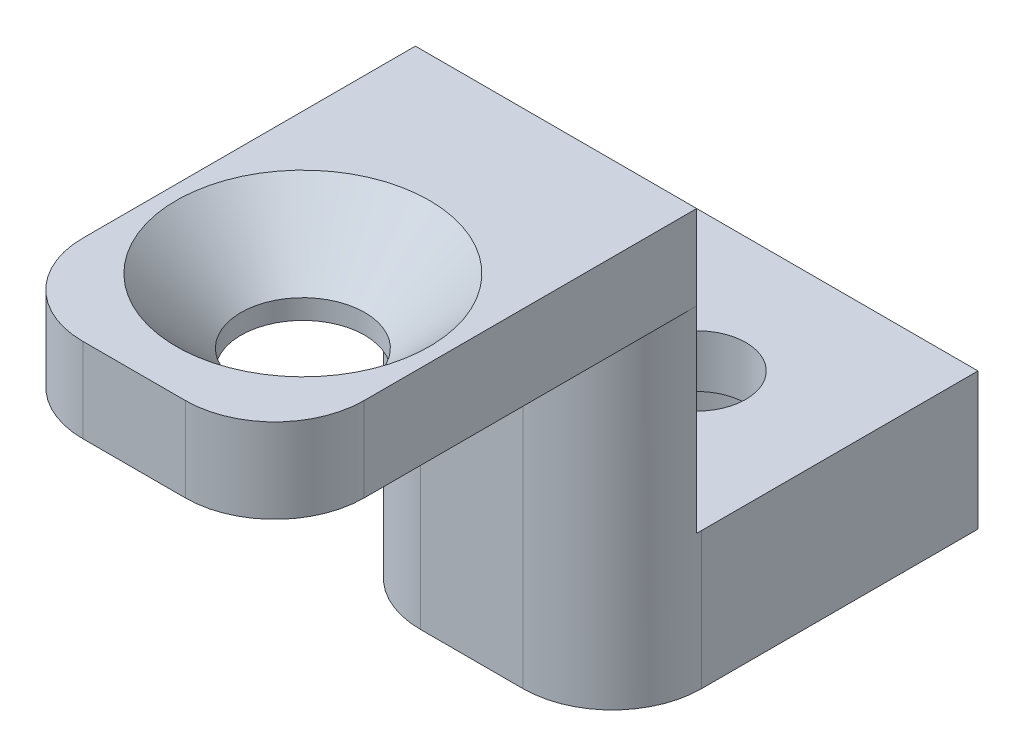
ISO-10303-21;
HEADER;
FILE_DESCRIPTION(('STEP AP214'),'2;1');
FILE_NAME('part.step','',(''),(''),'','','');
FILE_SCHEMA(('AUTOMOTIVE_DESIGN { 1 0 10303 214 1 1 1 1 }'));
ENDSEC;
DATA;
#1=APPLICATION_CONTEXT('core data for automotive mechanical design processes');
#2=APPLICATION_PROTOCOL_DEFINITION('international standard','automotive_design',2000,#1);
#3=PRODUCT_CONTEXT('',#1,'mechanical');
#4=PRODUCT('Part','Part','',(#3));
#5=PRODUCT_RELATED_PRODUCT_CATEGORY('part','',(#4));
#6=PRODUCT_DEFINITION_FORMATION('','',#4);
#7=PRODUCT_DEFINITION_CONTEXT('part definition',#1,'design');
#8=PRODUCT_DEFINITION('design','',#6,#7);
#9=PRODUCT_DEFINITION_SHAPE('','',#8);
#10=(LENGTH_UNIT() NAMED_UNIT(*) SI_UNIT(.MILLI.,.METRE.));
#11=(NAMED_UNIT(*) PLANE_ANGLE_UNIT() SI_UNIT($,.RADIAN.));
#12=(NAMED_UNIT(*) SI_UNIT($,.STERADIAN.) SOLID_ANGLE_UNIT());
#13=UNCERTAINTY_MEASURE_WITH_UNIT(LENGTH_MEASURE(1.E-05),#10,'distance_accuracy_value','');
#14=(GEOMETRIC_REPRESENTATION_CONTEXT(3) GLOBAL_UNCERTAINTY_ASSIGNED_CONTEXT((#13)) GLOBAL_UNIT_ASSIGNED_CONTEXT((#10,
#11,#12)) REPRESENTATION_CONTEXT('',''));
#15=CARTESIAN_POINT('',(0.,0.,0.));
#16=DIRECTION('',(0.,0.,1.));
#17=DIRECTION('',(1.,0.,0.));
#18=AXIS2_PLACEMENT_3D('',#15,#16,#17);
#19=CARTESIAN_POINT('',(5.,0.,0.));
#20=DIRECTION('',(1.,0.,0.));
#21=DIRECTION('',(0.,0.,-1.));
#22=AXIS2_PLACEMENT_3D('',#19,#20,#21);
#23=PLANE('',#22);
#24=DIRECTION('',(0.,0.,1.));
#25=VECTOR('',#24,1.);
#26=CARTESIAN_POINT('',(5.,-7.,-13.));
#27=LINE('',#26,#25);
#28=CARTESIAN_POINT('',(5.,-7.,-13.));
#29=VERTEX_POINT('',#28);
#30=CARTESIAN_POINT('',(5.,-7.,-3.175));
#31=VERTEX_POINT('',#30);
#32=EDGE_CURVE('E161',#29,#31,#27,.T.);
#33=ORIENTED_EDGE('',*,*,#32,.T.);
#34=DIRECTION('',(0.,-1.,0.));
#35=VECTOR('',#34,1.);
#36=CARTESIAN_POINT('',(5.,-11.87,-3.175));
#37=LINE('',#36,#35);
#38=CARTESIAN_POINT('',(5.,-11.87,-3.175));
#39=VERTEX_POINT('',#38);
#40=EDGE_CURVE('E143',#31,#39,#37,.T.);
#41=ORIENTED_EDGE('',*,*,#40,.T.);
#42=DIRECTION('',(0.,0.,-1.));
#43=VECTOR('',#42,1.);
#44=CARTESIAN_POINT('',(5.,-11.87,0.));
#45=LINE('',#44,#43);
#46=CARTESIAN_POINT('',(5.,-11.87,-13.));
#47=VERTEX_POINT('',#46);
#48=EDGE_CURVE('E136',#39,#47,#45,.T.);
#49=ORIENTED_EDGE('',*,*,#48,.T.);
#50=DIRECTION('',(0.,1.,0.));
#51=VECTOR('',#50,1.);
#52=CARTESIAN_POINT('',(5.,-11.87,-13.));
#53=LINE('',#52,#51);
#54=EDGE_CURVE('E140',#47,#29,#53,.T.);
#55=ORIENTED_EDGE('',*,*,#54,.T.);
#56=EDGE_LOOP('',(#33,#41,#49,#55));
#57=FACE_BOUND('',#56,.T.);
#58=ADVANCED_FACE('F34',(#57),#23,.T.);
#59=CARTESIAN_POINT('',(-5.,0.,0.));
#60=DIRECTION('',(1.,0.,0.));
#61=DIRECTION('',(0.,0.,-1.));
#62=AXIS2_PLACEMENT_3D('',#59,#60,#61);
#63=PLANE('',#62);
#64=DIRECTION('',(0.,0.,-1.));
#65=VECTOR('',#64,1.);
#66=CARTESIAN_POINT('',(-5.,-11.87,0.));
#67=LINE('',#66,#65);
#68=CARTESIAN_POINT('',(-5.,-11.87,-3.175));
#69=VERTEX_POINT('',#68);
#70=CARTESIAN_POINT('',(-5.,-11.87,-13.));
#71=VERTEX_POINT('',#70);
#72=EDGE_CURVE('E152',#69,#71,#67,.T.);
#73=ORIENTED_EDGE('',*,*,#72,.F.);
#74=DIRECTION('',(0.,-1.,0.));
#75=VECTOR('',#74,1.);
#76=CARTESIAN_POINT('',(-5.,0.,-3.175));
#77=LINE('',#76,#75);
#78=CARTESIAN_POINT('',(-5.,-7.,-3.175));
#79=VERTEX_POINT('',#78);
#80=EDGE_CURVE('E211',#69,#79,#77,.F.);
#81=ORIENTED_EDGE('',*,*,#80,.T.);
#82=DIRECTION('',(0.,0.,1.));
#83=VECTOR('',#82,1.);
#84=CARTESIAN_POINT('',(-5.,-7.,-13.));
#85=LINE('',#84,#83);
#86=CARTESIAN_POINT('',(-5.,-7.,-13.));
#87=VERTEX_POINT('',#86);
#88=EDGE_CURVE('E178',#87,#79,#85,.T.);
#89=ORIENTED_EDGE('',*,*,#88,.F.);
#90=DIRECTION('',(0.,1.,0.));
#91=VECTOR('',#90,1.);
#92=CARTESIAN_POINT('',(-5.,-11.87,-13.));
#93=LINE('',#92,#91);
#94=EDGE_CURVE('E176',#71,#87,#93,.T.);
#95=ORIENTED_EDGE('',*,*,#94,.F.);
#96=EDGE_LOOP('',(#73,#81,#89,#95));
#97=FACE_BOUND('',#96,.T.);
#98=ADVANCED_FACE('F259',(#97),#63,.F.);
#99=CARTESIAN_POINT('',(5.,3.,12.));
#100=DIRECTION('',(0.,0.,-1.));
#101=DIRECTION('',(-1.,0.,0.));
#102=AXIS2_PLACEMENT_3D('',#99,#100,#101);
#103=PLANE('',#102);
#104=DIRECTION('',(-1.,0.,0.));
#105=VECTOR('',#104,1.);
#106=CARTESIAN_POINT('',(5.,3.,12.));
#107=LINE('',#106,#105);
#108=CARTESIAN_POINT('',(1.825,3.,12.));
#109=VERTEX_POINT('',#108);
#110=CARTESIAN_POINT('',(-1.825,3.,12.));
#111=VERTEX_POINT('',#110);
#112=EDGE_CURVE('E171',#109,#111,#107,.T.);
#113=ORIENTED_EDGE('',*,*,#112,.T.);
#114=DIRECTION('',(0.,-1.,0.));
#115=VECTOR('',#114,1.);
#116=CARTESIAN_POINT('',(-1.825,3.,12.));
#117=LINE('',#116,#115);
#118=CARTESIAN_POINT('',(-1.825,0.,12.));
#119=VERTEX_POINT('',#118);
#120=EDGE_CURVE('E234',#111,#119,#117,.T.);
#121=ORIENTED_EDGE('',*,*,#120,.T.);
#122=DIRECTION('',(-1.,0.,0.));
#123=VECTOR('',#122,1.);
#124=CARTESIAN_POINT('',(5.,0.,12.));
#125=LINE('',#124,#123);
#126=CARTESIAN_POINT('',(1.825,0.,12.));
#127=VERTEX_POINT('',#126);
#128=EDGE_CURVE('E197',#127,#119,#125,.T.);
#129=ORIENTED_EDGE('',*,*,#128,.F.);
#130=DIRECTION('',(0.,-1.,0.));
#131=VECTOR('',#130,1.);
#132=CARTESIAN_POINT('',(1.825,3.,12.));
#133=LINE('',#132,#131);
#134=EDGE_CURVE('E232',#127,#109,#133,.F.);
#135=ORIENTED_EDGE('',*,*,#134,.T.);
#136=EDGE_LOOP('',(#113,#121,#129,#135));
#137=FACE_BOUND('',#136,.T.);
#138=ADVANCED_FACE('F279',(#137),#103,.F.);
#139=CARTESIAN_POINT('',(5.,0.,12.));
#140=DIRECTION('',(0.,1.,0.));
#141=DIRECTION('',(0.,0.,1.));
#142=AXIS2_PLACEMENT_3D('',#139,#140,#141);
#143=PLANE('',#142);
#144=CARTESIAN_POINT('',(0.,0.,6.));
#145=DIRECTION('',(0.,-1.,0.));
#146=DIRECTION('',(0.,0.,-1.));
#147=AXIS2_PLACEMENT_3D('',#144,#145,#146);
#148=CIRCLE('',#147,2.2);
#149=CARTESIAN_POINT('',(0.,0.,3.8));
#150=VERTEX_POINT('',#149);
#151=EDGE_CURVE('E325',#150,#150,#148,.T.);
#152=ORIENTED_EDGE('',*,*,#151,.F.);
#153=EDGE_LOOP('',(#152));
#154=FACE_BOUND('',#153,.T.);
#155=ORIENTED_EDGE('',*,*,#128,.T.);
#156=CARTESIAN_POINT('',(-1.825,0.,8.825));
#157=DIRECTION('',(0.,1.,0.));
#158=DIRECTION('',(0.,0.,1.));
#159=AXIS2_PLACEMENT_3D('',#156,#157,#158);
#160=CIRCLE('',#159,3.175);
#161=CARTESIAN_POINT('',(-5.,0.,8.825));
#162=VERTEX_POINT('',#161);
#163=EDGE_CURVE('E239',#119,#162,#160,.F.);
#164=ORIENTED_EDGE('',*,*,#163,.T.);
#165=DIRECTION('',(0.,0.,-1.));
#166=VECTOR('',#165,1.);
#167=CARTESIAN_POINT('',(-5.,0.,12.));
#168=LINE('',#167,#166);
#169=CARTESIAN_POINT('',(-5.,0.,-3.));
#170=VERTEX_POINT('',#169);
#171=EDGE_CURVE('E172',#162,#170,#168,.T.);
#172=ORIENTED_EDGE('',*,*,#171,.T.);
#173=DIRECTION('',(-1.,0.,0.));
#174=VECTOR('',#173,1.);
#175=CARTESIAN_POINT('',(5.,0.,-3.));
#176=LINE('',#175,#174);
#177=CARTESIAN_POINT('',(-4.99517349682947,0.,-3.));
#178=VERTEX_POINT('',#177);
#179=EDGE_CURVE('E223',#178,#170,#176,.T.);
#180=ORIENTED_EDGE('',*,*,#179,.F.);
#181=CARTESIAN_POINT('',(-1.825,0.,-3.175));
#182=DIRECTION('',(0.,1.,0.));
#183=DIRECTION('',(0.,0.,1.));
#184=AXIS2_PLACEMENT_3D('',#181,#182,#183);
#185=CIRCLE('',#184,3.175);
#186=CARTESIAN_POINT('',(-1.825,0.,0.));
#187=VERTEX_POINT('',#186);
#188=EDGE_CURVE('E42',#178,#187,#185,.T.);
#189=ORIENTED_EDGE('',*,*,#188,.T.);
#190=DIRECTION('',(-1.,0.,0.));
#191=VECTOR('',#190,1.);
#192=CARTESIAN_POINT('',(5.,0.,0.));
#193=LINE('',#192,#191);
#194=CARTESIAN_POINT('',(1.825,0.,0.));
#195=VERTEX_POINT('',#194);
#196=EDGE_CURVE('E194',#195,#187,#193,.T.);
#197=ORIENTED_EDGE('',*,*,#196,.F.);
#198=CARTESIAN_POINT('',(1.825,0.,-3.175));
#199=DIRECTION('',(0.,1.,0.));
#200=DIRECTION('',(0.,0.,1.));
#201=AXIS2_PLACEMENT_3D('',#198,#199,#200);
#202=CIRCLE('',#201,3.175);
#203=CARTESIAN_POINT('',(4.99517349682947,0.,-3.));
#204=VERTEX_POINT('',#203);
#205=EDGE_CURVE('E11',#195,#204,#202,.T.);
#206=ORIENTED_EDGE('',*,*,#205,.T.);
#207=DIRECTION('',(-1.,0.,0.));
#208=VECTOR('',#207,1.);
#209=CARTESIAN_POINT('',(5.,0.,-3.));
#210=LINE('',#209,#208);
#211=CARTESIAN_POINT('',(5.,0.,-3.));
#212=VERTEX_POINT('',#211);
#213=EDGE_CURVE('E217',#212,#204,#210,.T.);
#214=ORIENTED_EDGE('',*,*,#213,.F.);
#215=DIRECTION('',(0.,0.,-1.));
#216=VECTOR('',#215,1.);
#217=CARTESIAN_POINT('',(5.,0.,12.));
#218=LINE('',#217,#216);
#219=CARTESIAN_POINT('',(5.,0.,8.825));
#220=VERTEX_POINT('',#219);
#221=EDGE_CURVE('E49',#220,#212,#218,.T.);
#222=ORIENTED_EDGE('',*,*,#221,.F.);
#223=CARTESIAN_POINT('',(1.825,0.,8.825));
#224=DIRECTION('',(0.,1.,0.));
#225=DIRECTION('',(0.,0.,1.));
#226=AXIS2_PLACEMENT_3D('',#223,#224,#225);
#227=CIRCLE('',#226,3.175);
#228=EDGE_CURVE('E237',#220,#127,#227,.F.);
#229=ORIENTED_EDGE('',*,*,#228,.T.);
#230=EDGE_LOOP('',(#155,#164,#172,#180,#189,#197,#206,#214,#222,#229));
#231=FACE_BOUND('',#230,.T.);
#232=ADVANCED_FACE('F246',(#154,#231),#143,.F.);
#233=CARTESIAN_POINT('',(5.,0.,0.));
#234=DIRECTION('',(0.,0.,-1.));
#235=DIRECTION('',(0.,1.,0.));
#236=AXIS2_PLACEMENT_3D('',#233,#234,#235);
#237=PLANE('',#236);
#238=ORIENTED_EDGE('',*,*,#196,.T.);
#239=DIRECTION('',(0.,-1.,0.));
#240=VECTOR('',#239,1.);
#241=CARTESIAN_POINT('',(-1.825,0.,0.));
#242=LINE('',#241,#240);
#243=CARTESIAN_POINT('',(-1.825,-11.87,0.));
#244=VERTEX_POINT('',#243);
#245=EDGE_CURVE('E202',#187,#244,#242,.T.);
#246=ORIENTED_EDGE('',*,*,#245,.T.);
#247=DIRECTION('',(-1.,0.,0.));
#248=VECTOR('',#247,1.);
#249=CARTESIAN_POINT('',(5.,-11.87,0.));
#250=LINE('',#249,#248);
#251=CARTESIAN_POINT('',(1.825,-11.87,0.));
#252=VERTEX_POINT('',#251);
#253=EDGE_CURVE('E155',#252,#244,#250,.T.);
#254=ORIENTED_EDGE('',*,*,#253,.F.);
#255=DIRECTION('',(0.,-1.,0.));
#256=VECTOR('',#255,1.);
#257=CARTESIAN_POINT('',(1.825,0.,0.));
#258=LINE('',#257,#256);
#259=EDGE_CURVE('E200',#252,#195,#258,.F.);
#260=ORIENTED_EDGE('',*,*,#259,.T.);
#261=EDGE_LOOP('',(#238,#246,#254,#260));
#262=FACE_BOUND('',#261,.T.);
#263=ADVANCED_FACE('F252',(#262),#237,.F.);
#264=CARTESIAN_POINT('',(5.,-11.87,0.));
#265=DIRECTION('',(0.,1.,0.));
#266=DIRECTION('',(0.,0.,1.));
#267=AXIS2_PLACEMENT_3D('',#264,#265,#266);
#268=PLANE('',#267);
#269=CARTESIAN_POINT('',(0.,-11.87,-8.));
#270=DIRECTION('',(0.,-1.,0.));
#271=DIRECTION('',(0.,0.,-1.));
#272=AXIS2_PLACEMENT_3D('',#269,#270,#271);
#273=CIRCLE('',#272,3.2);
#274=CARTESIAN_POINT('',(0.,-11.87,-11.2));
#275=VERTEX_POINT('',#274);
#276=EDGE_CURVE('E339',#275,#275,#273,.T.);
#277=ORIENTED_EDGE('',*,*,#276,.F.);
#278=EDGE_LOOP('',(#277));
#279=FACE_BOUND('',#278,.T.);
#280=ORIENTED_EDGE('',*,*,#253,.T.);
#281=CARTESIAN_POINT('',(-1.825,-11.87,-3.175));
#282=DIRECTION('',(0.,1.,0.));
#283=DIRECTION('',(0.,0.,1.));
#284=AXIS2_PLACEMENT_3D('',#281,#282,#283);
#285=CIRCLE('',#284,3.175);
#286=EDGE_CURVE('E207',#244,#69,#285,.F.);
#287=ORIENTED_EDGE('',*,*,#286,.T.);
#288=ORIENTED_EDGE('',*,*,#72,.T.);
#289=DIRECTION('',(-1.,0.,0.));
#290=VECTOR('',#289,1.);
#291=CARTESIAN_POINT('',(5.,-11.87,-13.));
#292=LINE('',#291,#290);
#293=EDGE_CURVE('E148',#47,#71,#292,.T.);
#294=ORIENTED_EDGE('',*,*,#293,.F.);
#295=ORIENTED_EDGE('',*,*,#48,.F.);
#296=CARTESIAN_POINT('',(1.825,-11.87,-3.175));
#297=DIRECTION('',(0.,1.,0.));
#298=DIRECTION('',(0.,0.,1.));
#299=AXIS2_PLACEMENT_3D('',#296,#297,#298);
#300=CIRCLE('',#299,3.175);
#301=EDGE_CURVE('E205',#39,#252,#300,.F.);
#302=ORIENTED_EDGE('',*,*,#301,.T.);
#303=EDGE_LOOP('',(#280,#287,#288,#294,#295,#302));
#304=FACE_BOUND('',#303,.T.);
#305=ADVANCED_FACE('F150',(#279,#304),#268,.F.);
#306=CARTESIAN_POINT('',(5.,-11.87,-13.));
#307=DIRECTION('',(0.,0.,1.));
#308=DIRECTION('',(1.,0.,0.));
#309=AXIS2_PLACEMENT_3D('',#306,#307,#308);
#310=PLANE('',#309);
#311=ORIENTED_EDGE('',*,*,#94,.T.);
#312=DIRECTION('',(-1.,0.,0.));
#313=VECTOR('',#312,1.);
#314=CARTESIAN_POINT('',(5.,-7.,-13.));
#315=LINE('',#314,#313);
#316=EDGE_CURVE('E156',#29,#87,#315,.T.);
#317=ORIENTED_EDGE('',*,*,#316,.F.);
#318=ORIENTED_EDGE('',*,*,#54,.F.);
#319=ORIENTED_EDGE('',*,*,#293,.T.);
#320=EDGE_LOOP('',(#311,#317,#318,#319));
#321=FACE_BOUND('',#320,.T.);
#322=ADVANCED_FACE('F158',(#321),#310,.F.);
#323=CARTESIAN_POINT('',(5.,-7.,-13.));
#324=DIRECTION('',(0.,-1.,0.));
#325=DIRECTION('',(0.,0.,-1.));
#326=AXIS2_PLACEMENT_3D('',#323,#324,#325);
#327=PLANE('',#326);
#328=CARTESIAN_POINT('',(0.,-7.,-8.));
#329=DIRECTION('',(0.,-1.,0.));
#330=DIRECTION('',(0.,0.,-1.));
#331=AXIS2_PLACEMENT_3D('',#328,#329,#330);
#332=CIRCLE('',#331,1.75);
#333=CARTESIAN_POINT('',(0.,-7.,-9.75));
#334=VERTEX_POINT('',#333);
#335=EDGE_CURVE('E330',#334,#334,#332,.T.);
#336=ORIENTED_EDGE('',*,*,#335,.T.);
#337=EDGE_LOOP('',(#336));
#338=FACE_BOUND('',#337,.T.);
#339=ORIENTED_EDGE('',*,*,#88,.T.);
#340=CARTESIAN_POINT('',(-1.825,-7.,-3.175));
#341=DIRECTION('',(0.,-1.,0.));
#342=DIRECTION('',(0.,0.,-1.));
#343=AXIS2_PLACEMENT_3D('',#340,#341,#342);
#344=CIRCLE('',#343,3.175);
#345=CARTESIAN_POINT('',(-4.99517349682947,-7.,-3.));
#346=VERTEX_POINT('',#345);
#347=EDGE_CURVE('E215',#79,#346,#344,.F.);
#348=ORIENTED_EDGE('',*,*,#347,.T.);
#349=DIRECTION('',(-1.,0.,0.));
#350=VECTOR('',#349,1.);
#351=CARTESIAN_POINT('',(5.,-7.,-3.));
#352=LINE('',#351,#350);
#353=CARTESIAN_POINT('',(4.99517349682947,-7.,-3.));
#354=VERTEX_POINT('',#353);
#355=EDGE_CURVE('E189',#354,#346,#352,.T.);
#356=ORIENTED_EDGE('',*,*,#355,.F.);
#357=CARTESIAN_POINT('',(1.825,-7.,-3.175));
#358=DIRECTION('',(0.,-1.,0.));
#359=DIRECTION('',(0.,0.,-1.));
#360=AXIS2_PLACEMENT_3D('',#357,#358,#359);
#361=CIRCLE('',#360,3.175);
#362=EDGE_CURVE('E213',#354,#31,#361,.F.);
#363=ORIENTED_EDGE('',*,*,#362,.T.);
#364=ORIENTED_EDGE('',*,*,#32,.F.);
#365=ORIENTED_EDGE('',*,*,#316,.T.);
#366=EDGE_LOOP('',(#339,#348,#356,#363,#364,#365));
#367=FACE_BOUND('',#366,.T.);
#368=ADVANCED_FACE('F262',(#338,#367),#327,.F.);
#369=CARTESIAN_POINT('',(5.,-7.,-3.));
#370=DIRECTION('',(0.,0.,1.));
#371=DIRECTION('',(0.,-1.,0.));
#372=AXIS2_PLACEMENT_3D('',#369,#370,#371);
#373=PLANE('',#372);
#374=ORIENTED_EDGE('',*,*,#355,.T.);
#375=DIRECTION('',(0.,-1.,0.));
#376=VECTOR('',#375,1.);
#377=CARTESIAN_POINT('',(-4.99517349682947,0.,-3.));
#378=LINE('',#377,#376);
#379=EDGE_CURVE('E226',#346,#178,#378,.F.);
#380=ORIENTED_EDGE('',*,*,#379,.T.);
#381=ORIENTED_EDGE('',*,*,#179,.T.);
#382=DIRECTION('',(0.,1.,0.));
#383=VECTOR('',#382,1.);
#384=CARTESIAN_POINT('',(-5.,-7.,-3.));
#385=LINE('',#384,#383);
#386=CARTESIAN_POINT('',(-5.,3.,-3.));
#387=VERTEX_POINT('',#386);
#388=EDGE_CURVE('E181',#170,#387,#385,.T.);
#389=ORIENTED_EDGE('',*,*,#388,.T.);
#390=DIRECTION('',(-1.,0.,0.));
#391=VECTOR('',#390,1.);
#392=CARTESIAN_POINT('',(5.,3.,-3.));
#393=LINE('',#392,#391);
#394=CARTESIAN_POINT('',(5.,3.,-3.));
#395=VERTEX_POINT('',#394);
#396=EDGE_CURVE('E186',#395,#387,#393,.T.);
#397=ORIENTED_EDGE('',*,*,#396,.F.);
#398=DIRECTION('',(0.,1.,0.));
#399=VECTOR('',#398,1.);
#400=CARTESIAN_POINT('',(5.,-7.,-3.));
#401=LINE('',#400,#399);
#402=EDGE_CURVE('E163',#212,#395,#401,.T.);
#403=ORIENTED_EDGE('',*,*,#402,.F.);
#404=ORIENTED_EDGE('',*,*,#213,.T.);
#405=DIRECTION('',(0.,1.,0.));
#406=VECTOR('',#405,1.);
#407=CARTESIAN_POINT('',(4.99517349682947,0.,-3.));
#408=LINE('',#407,#406);
#409=EDGE_CURVE('E220',#204,#354,#408,.F.);
#410=ORIENTED_EDGE('',*,*,#409,.T.);
#411=EDGE_LOOP('',(#374,#380,#381,#389,#397,#403,#404,#410));
#412=FACE_BOUND('',#411,.T.);
#413=ADVANCED_FACE('F269',(#412),#373,.F.);
#414=CARTESIAN_POINT('',(5.,3.,-3.));
#415=DIRECTION('',(0.,-1.,0.));
#416=DIRECTION('',(0.,0.,-1.));
#417=AXIS2_PLACEMENT_3D('',#414,#415,#416);
#418=PLANE('',#417);
#419=CARTESIAN_POINT('',(0.,3.,6.));
#420=DIRECTION('',(0.,-1.,0.));
#421=DIRECTION('',(0.,0.,-1.));
#422=AXIS2_PLACEMENT_3D('',#419,#420,#421);
#423=CIRCLE('',#422,4.5);
#424=CARTESIAN_POINT('',(0.,3.,1.5));
#425=VERTEX_POINT('',#424);
#426=EDGE_CURVE('E174',#425,#425,#423,.T.);
#427=ORIENTED_EDGE('',*,*,#426,.T.);
#428=EDGE_LOOP('',(#427));
#429=FACE_BOUND('',#428,.T.);
#430=DIRECTION('',(0.,0.,1.));
#431=VECTOR('',#430,1.);
#432=CARTESIAN_POINT('',(-5.,3.,-3.));
#433=LINE('',#432,#431);
#434=CARTESIAN_POINT('',(-5.,3.,8.825));
#435=VERTEX_POINT('',#434);
#436=EDGE_CURVE('E183',#387,#435,#433,.T.);
#437=ORIENTED_EDGE('',*,*,#436,.T.);
#438=CARTESIAN_POINT('',(-1.825,3.,8.825));
#439=DIRECTION('',(0.,-1.,0.));
#440=DIRECTION('',(0.,0.,-1.));
#441=AXIS2_PLACEMENT_3D('',#438,#439,#440);
#442=CIRCLE('',#441,3.175);
#443=EDGE_CURVE('E57',#435,#111,#442,.F.);
#444=ORIENTED_EDGE('',*,*,#443,.T.);
#445=ORIENTED_EDGE('',*,*,#112,.F.);
#446=CARTESIAN_POINT('',(1.825,3.,8.825));
#447=DIRECTION('',(0.,-1.,0.));
#448=DIRECTION('',(0.,0.,-1.));
#449=AXIS2_PLACEMENT_3D('',#446,#447,#448);
#450=CIRCLE('',#449,3.175);
#451=CARTESIAN_POINT('',(5.,3.,8.825));
#452=VERTEX_POINT('',#451);
#453=EDGE_CURVE('E241',#109,#452,#450,.F.);
#454=ORIENTED_EDGE('',*,*,#453,.T.);
#455=DIRECTION('',(0.,0.,1.));
#456=VECTOR('',#455,1.);
#457=CARTESIAN_POINT('',(5.,3.,-3.));
#458=LINE('',#457,#456);
#459=EDGE_CURVE('E168',#395,#452,#458,.T.);
#460=ORIENTED_EDGE('',*,*,#459,.F.);
#461=ORIENTED_EDGE('',*,*,#396,.T.);
#462=EDGE_LOOP('',(#437,#444,#445,#454,#460,#461));
#463=FACE_BOUND('',#462,.T.);
#464=ADVANCED_FACE('F289',(#429,#463),#418,.F.);
#465=ORIENTED_EDGE('',*,*,#221,.T.);
#466=ORIENTED_EDGE('',*,*,#402,.T.);
#467=ORIENTED_EDGE('',*,*,#459,.T.);
#468=DIRECTION('',(0.,-1.,0.));
#469=VECTOR('',#468,1.);
#470=CARTESIAN_POINT('',(5.,0.,8.825));
#471=LINE('',#470,#469);
#472=EDGE_CURVE('E229',#452,#220,#471,.T.);
#473=ORIENTED_EDGE('',*,*,#472,.T.);
#474=EDGE_LOOP('',(#465,#466,#467,#473));
#475=FACE_BOUND('',#474,.T.);
#476=ADVANCED_FACE('F272',(#475),#23,.T.);
#477=ORIENTED_EDGE('',*,*,#388,.F.);
#478=ORIENTED_EDGE('',*,*,#171,.F.);
#479=DIRECTION('',(0.,-1.,0.));
#480=VECTOR('',#479,1.);
#481=CARTESIAN_POINT('',(-5.,0.,8.825));
#482=LINE('',#481,#480);
#483=EDGE_CURVE('E209',#162,#435,#482,.F.);
#484=ORIENTED_EDGE('',*,*,#483,.T.);
#485=ORIENTED_EDGE('',*,*,#436,.F.);
#486=EDGE_LOOP('',(#477,#478,#484,#485));
#487=FACE_BOUND('',#486,.T.);
#488=ADVANCED_FACE('F287',(#487),#63,.F.);
#489=CARTESIAN_POINT('',(0.,3.,6.));
#490=DIRECTION('',(0.,1.,0.));
#491=DIRECTION('',(0.,0.,1.));
#492=AXIS2_PLACEMENT_3D('',#489,#490,#491);
#493=CONICAL_SURFACE('',#492,4.5,0.785398163397443);
#494=CARTESIAN_POINT('',(0.,0.699999999999973,6.));
#495=DIRECTION('',(0.,-1.,0.));
#496=DIRECTION('',(0.,0.,-1.));
#497=AXIS2_PLACEMENT_3D('',#494,#495,#496);
#498=CIRCLE('',#497,2.2);
#499=CARTESIAN_POINT('',(0.,0.699999999999973,3.8));
#500=VERTEX_POINT('',#499);
#501=EDGE_CURVE('E322',#500,#500,#498,.T.);
#502=ORIENTED_EDGE('',*,*,#501,.T.);
#503=EDGE_LOOP('',(#502));
#504=FACE_BOUND('',#503,.T.);
#505=ORIENTED_EDGE('',*,*,#426,.F.);
#506=EDGE_LOOP('',(#505));
#507=FACE_BOUND('',#506,.T.);
#508=ADVANCED_FACE('F306',(#504,#507),#493,.F.);
#509=CARTESIAN_POINT('',(0.,0.,6.));
#510=DIRECTION('',(0.,-1.,0.));
#511=DIRECTION('',(0.,0.,-1.));
#512=AXIS2_PLACEMENT_3D('',#509,#510,#511);
#513=CYLINDRICAL_SURFACE('',#512,2.2);
#514=ORIENTED_EDGE('',*,*,#151,.T.);
#515=EDGE_LOOP('',(#514));
#516=FACE_BOUND('',#515,.T.);
#517=ORIENTED_EDGE('',*,*,#501,.F.);
#518=EDGE_LOOP('',(#517));
#519=FACE_BOUND('',#518,.T.);
#520=ADVANCED_FACE('F312',(#516,#519),#513,.F.);
#521=CARTESIAN_POINT('',(0.,-11.87,-8.));
#522=DIRECTION('',(0.,-1.,0.));
#523=DIRECTION('',(0.,0.,-1.));
#524=AXIS2_PLACEMENT_3D('',#521,#522,#523);
#525=CYLINDRICAL_SURFACE('',#524,1.75);
#526=ORIENTED_EDGE('',*,*,#335,.F.);
#527=EDGE_LOOP('',(#526));
#528=FACE_BOUND('',#527,.T.);
#529=CARTESIAN_POINT('',(0.,-8.87,-8.));
#530=DIRECTION('',(0.,-1.,0.));
#531=DIRECTION('',(0.,0.,-1.));
#532=AXIS2_PLACEMENT_3D('',#529,#530,#531);
#533=CIRCLE('',#532,1.75);
#534=CARTESIAN_POINT('',(0.,-8.87,-9.75));
#535=VERTEX_POINT('',#534);
#536=EDGE_CURVE('E333',#535,#535,#533,.T.);
#537=ORIENTED_EDGE('',*,*,#536,.T.);
#538=EDGE_LOOP('',(#537));
#539=FACE_BOUND('',#538,.T.);
#540=ADVANCED_FACE('F317',(#528,#539),#525,.F.);
#541=CARTESIAN_POINT('',(0.,-8.87,-9.75));
#542=DIRECTION('',(0.,1.,0.));
#543=DIRECTION('',(0.,0.,1.));
#544=AXIS2_PLACEMENT_3D('',#541,#542,#543);
#545=PLANE('',#544);
#546=ORIENTED_EDGE('',*,*,#536,.F.);
#547=EDGE_LOOP('',(#546));
#548=FACE_BOUND('',#547,.T.);
#549=CARTESIAN_POINT('',(0.,-8.87,-8.));
#550=DIRECTION('',(0.,-1.,0.));
#551=DIRECTION('',(0.,0.,-1.));
#552=AXIS2_PLACEMENT_3D('',#549,#550,#551);
#553=CIRCLE('',#552,3.2);
#554=CARTESIAN_POINT('',(0.,-8.87,-11.2));
#555=VERTEX_POINT('',#554);
#556=EDGE_CURVE('E336',#555,#555,#553,.T.);
#557=ORIENTED_EDGE('',*,*,#556,.T.);
#558=EDGE_LOOP('',(#557));
#559=FACE_BOUND('',#558,.T.);
#560=ADVANCED_FACE('F456',(#548,#559),#545,.F.);
#561=CARTESIAN_POINT('',(0.,-11.87,-8.));
#562=DIRECTION('',(0.,-1.,0.));
#563=DIRECTION('',(0.,0.,-1.));
#564=AXIS2_PLACEMENT_3D('',#561,#562,#563);
#565=CYLINDRICAL_SURFACE('',#564,3.2);
#566=ORIENTED_EDGE('',*,*,#556,.F.);
#567=EDGE_LOOP('',(#566));
#568=FACE_BOUND('',#567,.T.);
#569=ORIENTED_EDGE('',*,*,#276,.T.);
#570=EDGE_LOOP('',(#569));
#571=FACE_BOUND('',#570,.T.);
#572=ADVANCED_FACE('F343',(#568,#571),#565,.F.);
#573=CARTESIAN_POINT('',(-1.825,0.,-3.175));
#574=DIRECTION('',(0.,-1.,0.));
#575=DIRECTION('',(0.,0.,-1.));
#576=AXIS2_PLACEMENT_3D('',#573,#574,#575);
#577=CYLINDRICAL_SURFACE('',#576,3.175);
#578=ORIENTED_EDGE('',*,*,#347,.F.);
#579=ORIENTED_EDGE('',*,*,#80,.F.);
#580=ORIENTED_EDGE('',*,*,#286,.F.);
#581=ORIENTED_EDGE('',*,*,#245,.F.);
#582=ORIENTED_EDGE('',*,*,#188,.F.);
#583=ORIENTED_EDGE('',*,*,#379,.F.);
#584=EDGE_LOOP('',(#578,#579,#580,#581,#582,#583));
#585=FACE_BOUND('',#584,.T.);
#586=ADVANCED_FACE('F256',(#585),#577,.T.);
#587=CARTESIAN_POINT('',(1.825,0.,-3.175));
#588=DIRECTION('',(0.,1.,0.));
#589=DIRECTION('',(0.,0.,1.));
#590=AXIS2_PLACEMENT_3D('',#587,#588,#589);
#591=CYLINDRICAL_SURFACE('',#590,3.175);
#592=ORIENTED_EDGE('',*,*,#205,.F.);
#593=ORIENTED_EDGE('',*,*,#259,.F.);
#594=ORIENTED_EDGE('',*,*,#301,.F.);
#595=ORIENTED_EDGE('',*,*,#40,.F.);
#596=ORIENTED_EDGE('',*,*,#362,.F.);
#597=ORIENTED_EDGE('',*,*,#409,.F.);
#598=EDGE_LOOP('',(#592,#593,#594,#595,#596,#597));
#599=FACE_BOUND('',#598,.T.);
#600=ADVANCED_FACE('F265',(#599),#591,.T.);
#601=CARTESIAN_POINT('',(-1.825,3.,8.825));
#602=DIRECTION('',(0.,-1.,0.));
#603=DIRECTION('',(0.,0.,-1.));
#604=AXIS2_PLACEMENT_3D('',#601,#602,#603);
#605=CYLINDRICAL_SURFACE('',#604,3.175);
#606=ORIENTED_EDGE('',*,*,#443,.F.);
#607=ORIENTED_EDGE('',*,*,#483,.F.);
#608=ORIENTED_EDGE('',*,*,#163,.F.);
#609=ORIENTED_EDGE('',*,*,#120,.F.);
#610=EDGE_LOOP('',(#606,#607,#608,#609));
#611=FACE_BOUND('',#610,.T.);
#612=ADVANCED_FACE('F282',(#611),#605,.T.);
#613=CARTESIAN_POINT('',(1.825,0.,8.825));
#614=DIRECTION('',(0.,1.,0.));
#615=DIRECTION('',(0.,0.,1.));
#616=AXIS2_PLACEMENT_3D('',#613,#614,#615);
#617=CYLINDRICAL_SURFACE('',#616,3.175);
#618=ORIENTED_EDGE('',*,*,#453,.F.);
#619=ORIENTED_EDGE('',*,*,#134,.F.);
#620=ORIENTED_EDGE('',*,*,#228,.F.);
#621=ORIENTED_EDGE('',*,*,#472,.F.);
#622=EDGE_LOOP('',(#618,#619,#620,#621));
#623=FACE_BOUND('',#622,.T.);
#624=ADVANCED_FACE('F36',(#623),#617,.T.);
#625=CLOSED_SHELL('',(#58,#98,#138,#232,#263,#305,#322,#368,#413,#464,#476,#488,#508,#520,#540,
#560,#572,#586,#600,#612,#624));
#626=MANIFOLD_SOLID_BREP('B2',#625);
#627=ADVANCED_BREP_SHAPE_REPRESENTATION('',(#18,#626),#14);
#628=SHAPE_DEFINITION_REPRESENTATION(#9,#627);
ENDSEC;
END-ISO-10303-21;
